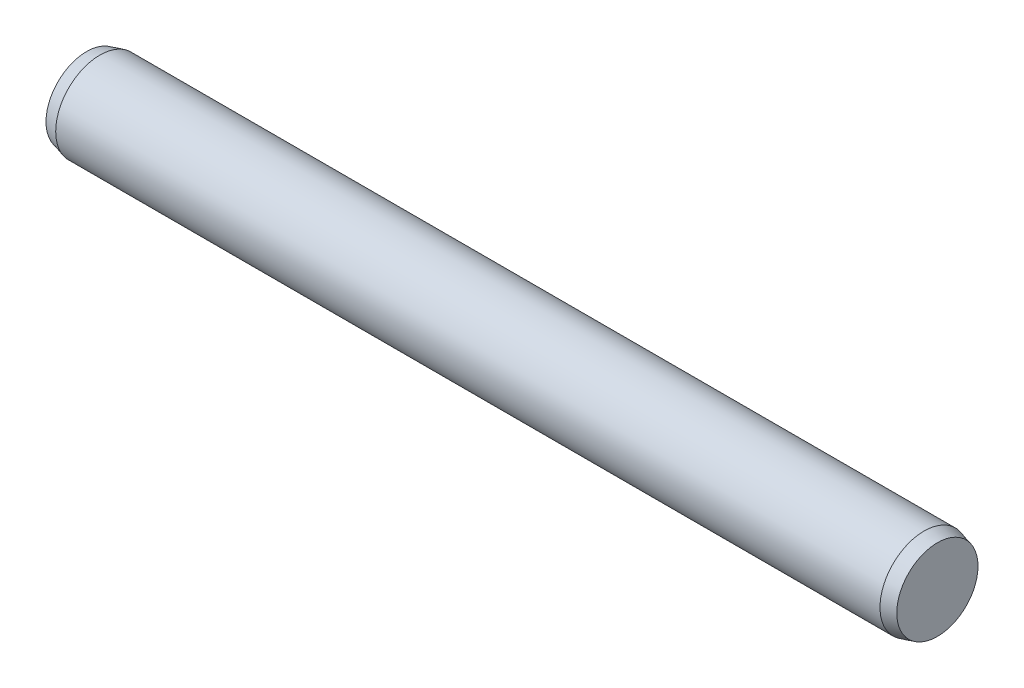
ISO-10303-21;
HEADER;
FILE_DESCRIPTION(('STEP AP214'),'2;1');
FILE_NAME('part.step','',(''),(''),'','','');
FILE_SCHEMA(('AUTOMOTIVE_DESIGN { 1 0 10303 214 1 1 1 1 }'));
ENDSEC;
DATA;
#1=APPLICATION_CONTEXT('core data for automotive mechanical design processes');
#2=APPLICATION_PROTOCOL_DEFINITION('international standard','automotive_design',2000,#1);
#3=PRODUCT_CONTEXT('',#1,'mechanical');
#4=PRODUCT('Part','Part','',(#3));
#5=PRODUCT_RELATED_PRODUCT_CATEGORY('part','',(#4));
#6=PRODUCT_DEFINITION_FORMATION('','',#4);
#7=PRODUCT_DEFINITION_CONTEXT('part definition',#1,'design');
#8=PRODUCT_DEFINITION('design','',#6,#7);
#9=PRODUCT_DEFINITION_SHAPE('','',#8);
#10=(LENGTH_UNIT() NAMED_UNIT(*) SI_UNIT(.MILLI.,.METRE.));
#11=(NAMED_UNIT(*) PLANE_ANGLE_UNIT() SI_UNIT($,.RADIAN.));
#12=(NAMED_UNIT(*) SI_UNIT($,.STERADIAN.) SOLID_ANGLE_UNIT());
#13=UNCERTAINTY_MEASURE_WITH_UNIT(LENGTH_MEASURE(1.E-05),#10,'distance_accuracy_value','');
#14=(GEOMETRIC_REPRESENTATION_CONTEXT(3) GLOBAL_UNCERTAINTY_ASSIGNED_CONTEXT((#13)) GLOBAL_UNIT_ASSIGNED_CONTEXT((#10,
#11,#12)) REPRESENTATION_CONTEXT('',''));
#15=CARTESIAN_POINT('',(0.,0.,0.));
#16=DIRECTION('',(0.,0.,1.));
#17=DIRECTION('',(1.,0.,0.));
#18=AXIS2_PLACEMENT_3D('',#15,#16,#17);
#19=CARTESIAN_POINT('',(-14.,0.,0.));
#20=DIRECTION('',(1.,0.,0.));
#21=DIRECTION('',(0.,0.,-1.));
#22=AXIS2_PLACEMENT_3D('',#19,#20,#21);
#23=CYLINDRICAL_SURFACE('',#22,1.5);
#24=CARTESIAN_POINT('',(-14.,0.,0.));
#25=DIRECTION('',(-1.,0.,0.));
#26=DIRECTION('',(0.,0.,1.));
#27=AXIS2_PLACEMENT_3D('',#24,#25,#26);
#28=CIRCLE('',#27,1.5);
#29=CARTESIAN_POINT('',(-14.,0.,1.5));
#30=VERTEX_POINT('',#29);
#31=EDGE_CURVE('E44',#30,#30,#28,.T.);
#32=ORIENTED_EDGE('',*,*,#31,.F.);
#33=EDGE_LOOP('',(#32));
#34=FACE_BOUND('',#33,.T.);
#35=CARTESIAN_POINT('',(14.,0.,0.));
#36=DIRECTION('',(1.,0.,0.));
#37=DIRECTION('',(0.,0.,-1.));
#38=AXIS2_PLACEMENT_3D('',#35,#36,#37);
#39=CIRCLE('',#38,1.5);
#40=CARTESIAN_POINT('',(14.,0.,-1.5));
#41=VERTEX_POINT('',#40);
#42=EDGE_CURVE('E10',#41,#41,#39,.T.);
#43=ORIENTED_EDGE('',*,*,#42,.F.);
#44=EDGE_LOOP('',(#43));
#45=FACE_BOUND('',#44,.T.);
#46=ADVANCED_FACE('F30',(#34,#45),#23,.T.);
#47=CARTESIAN_POINT('',(14.,0.,0.));
#48=DIRECTION('',(-1.,0.,0.));
#49=DIRECTION('',(0.,0.,-1.));
#50=AXIS2_PLACEMENT_3D('',#47,#48,#49);
#51=CONICAL_SURFACE('',#50,1.5,0.26179938779915);
#52=CARTESIAN_POINT('',(14.45,0.,0.));
#53=DIRECTION('',(1.,0.,0.));
#54=DIRECTION('',(0.,0.,-1.));
#55=AXIS2_PLACEMENT_3D('',#52,#53,#54);
#56=CIRCLE('',#55,1.379422863406);
#57=CARTESIAN_POINT('',(14.45,0.,-1.379422863406));
#58=VERTEX_POINT('',#57);
#59=EDGE_CURVE('E36',#58,#58,#56,.T.);
#60=ORIENTED_EDGE('',*,*,#59,.F.);
#61=EDGE_LOOP('',(#60));
#62=FACE_BOUND('',#61,.T.);
#63=ORIENTED_EDGE('',*,*,#42,.T.);
#64=EDGE_LOOP('',(#63));
#65=FACE_BOUND('',#64,.T.);
#66=ADVANCED_FACE('F54',(#62,#65),#51,.T.);
#67=CARTESIAN_POINT('',(14.45,0.,0.));
#68=DIRECTION('',(1.,0.,0.));
#69=DIRECTION('',(0.,0.,-1.));
#70=AXIS2_PLACEMENT_3D('',#67,#68,#69);
#71=PLANE('',#70);
#72=ORIENTED_EDGE('',*,*,#59,.T.);
#73=EDGE_LOOP('',(#72));
#74=FACE_BOUND('',#73,.T.);
#75=ADVANCED_FACE('F58',(#74),#71,.T.);
#76=CARTESIAN_POINT('',(-14.,0.,0.));
#77=DIRECTION('',(1.,0.,0.));
#78=DIRECTION('',(0.,0.,1.));
#79=AXIS2_PLACEMENT_3D('',#76,#77,#78);
#80=CONICAL_SURFACE('',#79,1.5,0.26179938779915);
#81=CARTESIAN_POINT('',(-14.45,0.,0.));
#82=DIRECTION('',(-1.,0.,0.));
#83=DIRECTION('',(0.,0.,1.));
#84=AXIS2_PLACEMENT_3D('',#81,#82,#83);
#85=CIRCLE('',#84,1.379422863406);
#86=CARTESIAN_POINT('',(-14.45,0.,1.379422863406));
#87=VERTEX_POINT('',#86);
#88=EDGE_CURVE('E40',#87,#87,#85,.T.);
#89=ORIENTED_EDGE('',*,*,#88,.F.);
#90=EDGE_LOOP('',(#89));
#91=FACE_BOUND('',#90,.T.);
#92=ORIENTED_EDGE('',*,*,#31,.T.);
#93=EDGE_LOOP('',(#92));
#94=FACE_BOUND('',#93,.T.);
#95=ADVANCED_FACE('F50',(#91,#94),#80,.T.);
#96=CARTESIAN_POINT('',(-14.45,0.,0.));
#97=DIRECTION('',(-1.,0.,0.));
#98=DIRECTION('',(0.,0.,1.));
#99=AXIS2_PLACEMENT_3D('',#96,#97,#98);
#100=PLANE('',#99);
#101=ORIENTED_EDGE('',*,*,#88,.T.);
#102=EDGE_LOOP('',(#101));
#103=FACE_BOUND('',#102,.T.);
#104=ADVANCED_FACE('F67',(#103),#100,.T.);
#105=CLOSED_SHELL('',(#46,#66,#75,#95,#104));
#106=MANIFOLD_SOLID_BREP('B2',#105);
#107=ADVANCED_BREP_SHAPE_REPRESENTATION('',(#18,#106),#14);
#108=SHAPE_DEFINITION_REPRESENTATION(#9,#107);
ENDSEC;
END-ISO-10303-21;
